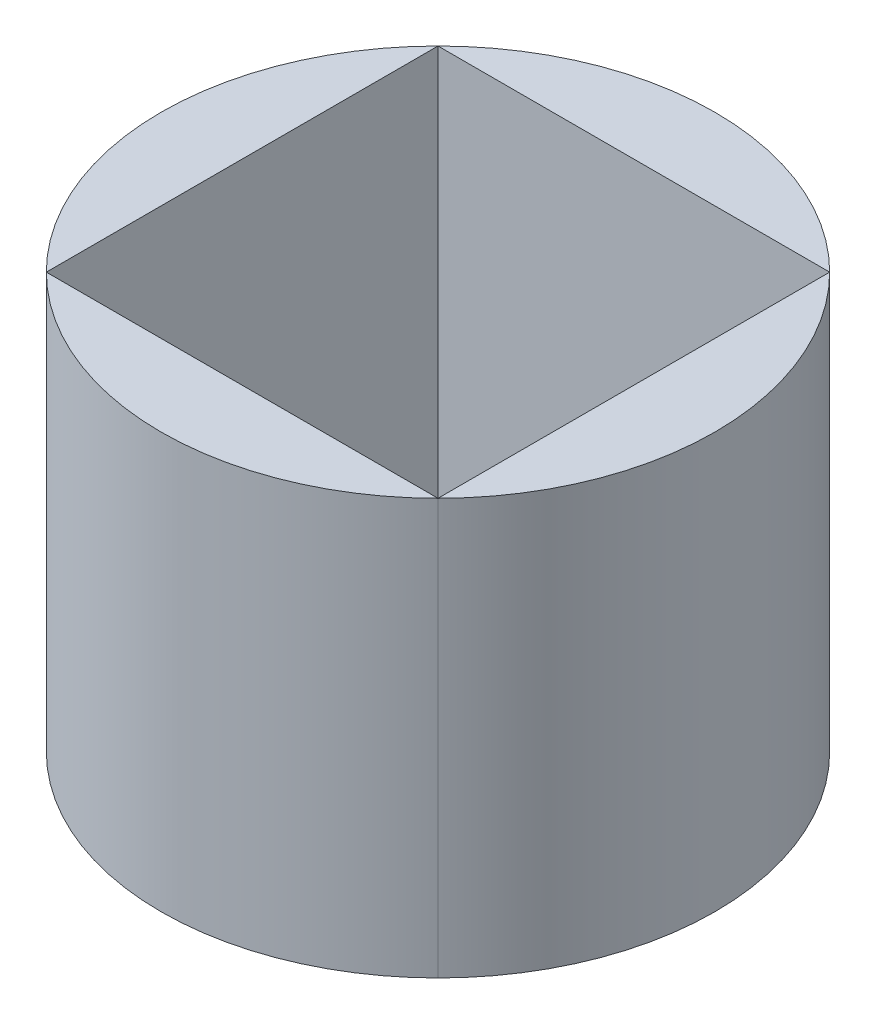
ISO-10303-21;
HEADER;
FILE_DESCRIPTION(('STEP AP214'),'2;1');
FILE_NAME('part.step','',(''),(''),'','','');
FILE_SCHEMA(('AUTOMOTIVE_DESIGN { 1 0 10303 214 1 1 1 1 }'));
ENDSEC;
DATA;
#1=APPLICATION_CONTEXT('core data for automotive mechanical design processes');
#2=APPLICATION_PROTOCOL_DEFINITION('international standard','automotive_design',2000,#1);
#3=PRODUCT_CONTEXT('',#1,'mechanical');
#4=PRODUCT('Part','Part','',(#3));
#5=PRODUCT_RELATED_PRODUCT_CATEGORY('part','',(#4));
#6=PRODUCT_DEFINITION_FORMATION('','',#4);
#7=PRODUCT_DEFINITION_CONTEXT('part definition',#1,'design');
#8=PRODUCT_DEFINITION('design','',#6,#7);
#9=PRODUCT_DEFINITION_SHAPE('','',#8);
#10=(LENGTH_UNIT() NAMED_UNIT(*) SI_UNIT(.MILLI.,.METRE.));
#11=(NAMED_UNIT(*) PLANE_ANGLE_UNIT() SI_UNIT($,.RADIAN.));
#12=(NAMED_UNIT(*) SI_UNIT($,.STERADIAN.) SOLID_ANGLE_UNIT());
#13=UNCERTAINTY_MEASURE_WITH_UNIT(LENGTH_MEASURE(1.E-05),#10,'distance_accuracy_value','');
#14=(GEOMETRIC_REPRESENTATION_CONTEXT(3) GLOBAL_UNCERTAINTY_ASSIGNED_CONTEXT((#13)) GLOBAL_UNIT_ASSIGNED_CONTEXT((#10,
#11,#12)) REPRESENTATION_CONTEXT('',''));
#15=CARTESIAN_POINT('',(0.,0.,0.));
#16=DIRECTION('',(0.,0.,1.));
#17=DIRECTION('',(1.,0.,0.));
#18=AXIS2_PLACEMENT_3D('',#15,#16,#17);
#19=CARTESIAN_POINT('',(-1.41421356237309,3.,0.));
#20=DIRECTION('',(-1.,0.,0.));
#21=DIRECTION('',(0.,0.,1.));
#22=AXIS2_PLACEMENT_3D('',#19,#20,#21);
#23=PLANE('',#22);
#24=DIRECTION('',(0.,0.,-1.));
#25=VECTOR('',#24,1.);
#26=CARTESIAN_POINT('',(-1.41421356237309,0.,0.));
#27=LINE('',#26,#25);
#28=CARTESIAN_POINT('',(-1.41421356237309,0.,1.41421356237309));
#29=VERTEX_POINT('',#28);
#30=CARTESIAN_POINT('',(-1.41421356237309,0.,-1.4142135623731));
#31=VERTEX_POINT('',#30);
#32=EDGE_CURVE('E85',#29,#31,#27,.T.);
#33=ORIENTED_EDGE('',*,*,#32,.T.);
#34=DIRECTION('',(0.,-1.,0.));
#35=VECTOR('',#34,1.);
#36=CARTESIAN_POINT('',(-1.41421356237309,3.,-1.4142135623731));
#37=LINE('',#36,#35);
#38=CARTESIAN_POINT('',(-1.41421356237309,3.,-1.4142135623731));
#39=VERTEX_POINT('',#38);
#40=EDGE_CURVE('E12',#39,#31,#37,.T.);
#41=ORIENTED_EDGE('',*,*,#40,.F.);
#42=DIRECTION('',(0.,0.,-1.));
#43=VECTOR('',#42,1.);
#44=CARTESIAN_POINT('',(-1.41421356237309,3.,0.));
#45=LINE('',#44,#43);
#46=CARTESIAN_POINT('',(-1.41421356237309,3.,1.41421356237309));
#47=VERTEX_POINT('',#46);
#48=EDGE_CURVE('E84',#47,#39,#45,.T.);
#49=ORIENTED_EDGE('',*,*,#48,.F.);
#50=DIRECTION('',(0.,-1.,0.));
#51=VECTOR('',#50,1.);
#52=CARTESIAN_POINT('',(-1.41421356237309,3.,1.41421356237309));
#53=LINE('',#52,#51);
#54=EDGE_CURVE('E62',#47,#29,#53,.T.);
#55=ORIENTED_EDGE('',*,*,#54,.T.);
#56=EDGE_LOOP('',(#33,#41,#49,#55));
#57=FACE_BOUND('',#56,.T.);
#58=ADVANCED_FACE('F54',(#57),#23,.F.);
#59=CARTESIAN_POINT('',(0.,3.,0.));
#60=DIRECTION('',(0.,-1.,0.));
#61=DIRECTION('',(0.,0.,-1.));
#62=AXIS2_PLACEMENT_3D('',#59,#60,#61);
#63=CYLINDRICAL_SURFACE('',#62,2.);
#64=CARTESIAN_POINT('',(0.,0.,0.));
#65=DIRECTION('',(0.,1.,0.));
#66=DIRECTION('',(0.,0.,1.));
#67=AXIS2_PLACEMENT_3D('',#64,#65,#66);
#68=CIRCLE('',#67,2.);
#69=EDGE_CURVE('E77',#31,#29,#68,.T.);
#70=ORIENTED_EDGE('',*,*,#69,.T.);
#71=ORIENTED_EDGE('',*,*,#54,.F.);
#72=CARTESIAN_POINT('',(0.,3.,0.));
#73=DIRECTION('',(0.,1.,0.));
#74=DIRECTION('',(0.,0.,1.));
#75=AXIS2_PLACEMENT_3D('',#72,#73,#74);
#76=CIRCLE('',#75,2.);
#77=EDGE_CURVE('E69',#39,#47,#76,.T.);
#78=ORIENTED_EDGE('',*,*,#77,.F.);
#79=ORIENTED_EDGE('',*,*,#40,.T.);
#80=EDGE_LOOP('',(#70,#71,#78,#79));
#81=FACE_BOUND('',#80,.T.);
#82=ADVANCED_FACE('F80',(#81),#63,.T.);
#83=CARTESIAN_POINT('',(0.,3.,0.));
#84=DIRECTION('',(0.,1.,0.));
#85=DIRECTION('',(0.,0.,1.));
#86=AXIS2_PLACEMENT_3D('',#83,#84,#85);
#87=PLANE('',#86);
#88=ORIENTED_EDGE('',*,*,#48,.T.);
#89=ORIENTED_EDGE('',*,*,#77,.T.);
#90=EDGE_LOOP('',(#88,#89));
#91=FACE_BOUND('',#90,.T.);
#92=ADVANCED_FACE('F92',(#91),#87,.T.);
#93=CARTESIAN_POINT('',(0.,0.,0.));
#94=DIRECTION('',(0.,1.,0.));
#95=DIRECTION('',(0.,0.,1.));
#96=AXIS2_PLACEMENT_3D('',#93,#94,#95);
#97=PLANE('',#96);
#98=ORIENTED_EDGE('',*,*,#32,.F.);
#99=ORIENTED_EDGE('',*,*,#69,.F.);
#100=EDGE_LOOP('',(#98,#99));
#101=FACE_BOUND('',#100,.T.);
#102=ADVANCED_FACE('F88',(#101),#97,.F.);
#103=CLOSED_SHELL('',(#58,#82,#92,#102));
#104=MANIFOLD_SOLID_BREP('B2',#103);
#105=CARTESIAN_POINT('',(0.,3.,1.41421356237309));
#106=DIRECTION('',(0.,0.,-1.));
#107=DIRECTION('',(-1.,0.,0.));
#108=AXIS2_PLACEMENT_3D('',#105,#106,#107);
#109=PLANE('',#108);
#110=DIRECTION('',(1.,0.,0.));
#111=VECTOR('',#110,1.);
#112=CARTESIAN_POINT('',(0.,0.,1.41421356237309));
#113=LINE('',#112,#111);
#114=CARTESIAN_POINT('',(-1.41421356237309,0.,1.41421356237309));
#115=VERTEX_POINT('',#114);
#116=CARTESIAN_POINT('',(1.41421356237309,0.,1.41421356237309));
#117=VERTEX_POINT('',#116);
#118=EDGE_CURVE('E164',#115,#117,#113,.T.);
#119=ORIENTED_EDGE('',*,*,#118,.F.);
#120=DIRECTION('',(0.,-1.,0.));
#121=VECTOR('',#120,1.);
#122=CARTESIAN_POINT('',(-1.41421356237309,3.,1.41421356237309));
#123=LINE('',#122,#121);
#124=CARTESIAN_POINT('',(-1.41421356237309,3.,1.41421356237309));
#125=VERTEX_POINT('',#124);
#126=EDGE_CURVE('E52',#125,#115,#123,.T.);
#127=ORIENTED_EDGE('',*,*,#126,.F.);
#128=DIRECTION('',(1.,0.,0.));
#129=VECTOR('',#128,1.);
#130=CARTESIAN_POINT('',(0.,3.,1.41421356237309));
#131=LINE('',#130,#129);
#132=CARTESIAN_POINT('',(1.41421356237309,3.,1.41421356237309));
#133=VERTEX_POINT('',#132);
#134=EDGE_CURVE('E165',#125,#133,#131,.T.);
#135=ORIENTED_EDGE('',*,*,#134,.T.);
#136=DIRECTION('',(0.,-1.,0.));
#137=VECTOR('',#136,1.);
#138=CARTESIAN_POINT('',(1.41421356237309,3.,1.41421356237309));
#139=LINE('',#138,#137);
#140=EDGE_CURVE('E144',#133,#117,#139,.T.);
#141=ORIENTED_EDGE('',*,*,#140,.T.);
#142=EDGE_LOOP('',(#119,#127,#135,#141));
#143=FACE_BOUND('',#142,.T.);
#144=ADVANCED_FACE('F136',(#143),#109,.T.);
#145=CARTESIAN_POINT('',(0.,3.,0.));
#146=DIRECTION('',(0.,-1.,0.));
#147=DIRECTION('',(0.,0.,-1.));
#148=AXIS2_PLACEMENT_3D('',#145,#146,#147);
#149=CYLINDRICAL_SURFACE('',#148,2.);
#150=CARTESIAN_POINT('',(0.,0.,0.));
#151=DIRECTION('',(0.,1.,0.));
#152=DIRECTION('',(0.,0.,1.));
#153=AXIS2_PLACEMENT_3D('',#150,#151,#152);
#154=CIRCLE('',#153,2.);
#155=EDGE_CURVE('E166',#115,#117,#154,.T.);
#156=ORIENTED_EDGE('',*,*,#155,.T.);
#157=ORIENTED_EDGE('',*,*,#140,.F.);
#158=CARTESIAN_POINT('',(0.,3.,0.));
#159=DIRECTION('',(0.,1.,0.));
#160=DIRECTION('',(0.,0.,1.));
#161=AXIS2_PLACEMENT_3D('',#158,#159,#160);
#162=CIRCLE('',#161,2.);
#163=EDGE_CURVE('E151',#125,#133,#162,.T.);
#164=ORIENTED_EDGE('',*,*,#163,.F.);
#165=ORIENTED_EDGE('',*,*,#126,.T.);
#166=EDGE_LOOP('',(#156,#157,#164,#165));
#167=FACE_BOUND('',#166,.T.);
#168=ADVANCED_FACE('F167',(#167),#149,.T.);
#169=CARTESIAN_POINT('',(0.,3.,0.));
#170=DIRECTION('',(0.,1.,0.));
#171=DIRECTION('',(0.,0.,1.));
#172=AXIS2_PLACEMENT_3D('',#169,#170,#171);
#173=PLANE('',#172);
#174=ORIENTED_EDGE('',*,*,#134,.F.);
#175=ORIENTED_EDGE('',*,*,#163,.T.);
#176=EDGE_LOOP('',(#174,#175));
#177=FACE_BOUND('',#176,.T.);
#178=ADVANCED_FACE('F175',(#177),#173,.T.);
#179=CARTESIAN_POINT('',(0.,0.,0.));
#180=DIRECTION('',(0.,1.,0.));
#181=DIRECTION('',(0.,0.,1.));
#182=AXIS2_PLACEMENT_3D('',#179,#180,#181);
#183=PLANE('',#182);
#184=ORIENTED_EDGE('',*,*,#118,.T.);
#185=ORIENTED_EDGE('',*,*,#155,.F.);
#186=EDGE_LOOP('',(#184,#185));
#187=FACE_BOUND('',#186,.T.);
#188=ADVANCED_FACE('F170',(#187),#183,.F.);
#189=CLOSED_SHELL('',(#144,#168,#178,#188));
#190=MANIFOLD_SOLID_BREP('B6',#189);
#191=CARTESIAN_POINT('',(1.41421356237309,3.,0.));
#192=DIRECTION('',(-1.,0.,0.));
#193=DIRECTION('',(0.,0.,1.));
#194=AXIS2_PLACEMENT_3D('',#191,#192,#193);
#195=PLANE('',#194);
#196=DIRECTION('',(0.,0.,-1.));
#197=VECTOR('',#196,1.);
#198=CARTESIAN_POINT('',(1.41421356237309,0.,0.));
#199=LINE('',#198,#197);
#200=CARTESIAN_POINT('',(1.41421356237309,0.,1.41421356237309));
#201=VERTEX_POINT('',#200);
#202=CARTESIAN_POINT('',(1.41421356237309,0.,-1.4142135623731));
#203=VERTEX_POINT('',#202);
#204=EDGE_CURVE('E245',#201,#203,#199,.T.);
#205=ORIENTED_EDGE('',*,*,#204,.F.);
#206=DIRECTION('',(0.,-1.,0.));
#207=VECTOR('',#206,1.);
#208=CARTESIAN_POINT('',(1.41421356237309,3.,1.41421356237309));
#209=LINE('',#208,#207);
#210=CARTESIAN_POINT('',(1.41421356237309,3.,1.41421356237309));
#211=VERTEX_POINT('',#210);
#212=EDGE_CURVE('E134',#211,#201,#209,.T.);
#213=ORIENTED_EDGE('',*,*,#212,.F.);
#214=DIRECTION('',(0.,0.,-1.));
#215=VECTOR('',#214,1.);
#216=CARTESIAN_POINT('',(1.41421356237309,3.,0.));
#217=LINE('',#216,#215);
#218=CARTESIAN_POINT('',(1.41421356237309,3.,-1.4142135623731));
#219=VERTEX_POINT('',#218);
#220=EDGE_CURVE('E246',#211,#219,#217,.T.);
#221=ORIENTED_EDGE('',*,*,#220,.T.);
#222=DIRECTION('',(0.,-1.,0.));
#223=VECTOR('',#222,1.);
#224=CARTESIAN_POINT('',(1.41421356237309,3.,-1.4142135623731));
#225=LINE('',#224,#223);
#226=EDGE_CURVE('E225',#219,#203,#225,.T.);
#227=ORIENTED_EDGE('',*,*,#226,.T.);
#228=EDGE_LOOP('',(#205,#213,#221,#227));
#229=FACE_BOUND('',#228,.T.);
#230=ADVANCED_FACE('F217',(#229),#195,.T.);
#231=CARTESIAN_POINT('',(0.,3.,0.));
#232=DIRECTION('',(0.,-1.,0.));
#233=DIRECTION('',(0.,0.,-1.));
#234=AXIS2_PLACEMENT_3D('',#231,#232,#233);
#235=CYLINDRICAL_SURFACE('',#234,2.);
#236=CARTESIAN_POINT('',(0.,0.,0.));
#237=DIRECTION('',(0.,1.,0.));
#238=DIRECTION('',(0.,0.,1.));
#239=AXIS2_PLACEMENT_3D('',#236,#237,#238);
#240=CIRCLE('',#239,2.);
#241=EDGE_CURVE('E247',#201,#203,#240,.T.);
#242=ORIENTED_EDGE('',*,*,#241,.T.);
#243=ORIENTED_EDGE('',*,*,#226,.F.);
#244=CARTESIAN_POINT('',(0.,3.,0.));
#245=DIRECTION('',(0.,1.,0.));
#246=DIRECTION('',(0.,0.,1.));
#247=AXIS2_PLACEMENT_3D('',#244,#245,#246);
#248=CIRCLE('',#247,2.);
#249=EDGE_CURVE('E232',#211,#219,#248,.T.);
#250=ORIENTED_EDGE('',*,*,#249,.F.);
#251=ORIENTED_EDGE('',*,*,#212,.T.);
#252=EDGE_LOOP('',(#242,#243,#250,#251));
#253=FACE_BOUND('',#252,.T.);
#254=ADVANCED_FACE('F248',(#253),#235,.T.);
#255=CARTESIAN_POINT('',(0.,3.,0.));
#256=DIRECTION('',(0.,1.,0.));
#257=DIRECTION('',(0.,0.,1.));
#258=AXIS2_PLACEMENT_3D('',#255,#256,#257);
#259=PLANE('',#258);
#260=ORIENTED_EDGE('',*,*,#220,.F.);
#261=ORIENTED_EDGE('',*,*,#249,.T.);
#262=EDGE_LOOP('',(#260,#261));
#263=FACE_BOUND('',#262,.T.);
#264=ADVANCED_FACE('F256',(#263),#259,.T.);
#265=CARTESIAN_POINT('',(0.,0.,0.));
#266=DIRECTION('',(0.,1.,0.));
#267=DIRECTION('',(0.,0.,1.));
#268=AXIS2_PLACEMENT_3D('',#265,#266,#267);
#269=PLANE('',#268);
#270=ORIENTED_EDGE('',*,*,#204,.T.);
#271=ORIENTED_EDGE('',*,*,#241,.F.);
#272=EDGE_LOOP('',(#270,#271));
#273=FACE_BOUND('',#272,.T.);
#274=ADVANCED_FACE('F251',(#273),#269,.F.);
#275=CLOSED_SHELL('',(#230,#254,#264,#274));
#276=MANIFOLD_SOLID_BREP('B46',#275);
#277=CARTESIAN_POINT('',(0.,3.,-1.4142135623731));
#278=DIRECTION('',(0.,0.,-1.));
#279=DIRECTION('',(-1.,0.,0.));
#280=AXIS2_PLACEMENT_3D('',#277,#278,#279);
#281=PLANE('',#280);
#282=DIRECTION('',(1.,0.,0.));
#283=VECTOR('',#282,1.);
#284=CARTESIAN_POINT('',(0.,0.,-1.4142135623731));
#285=LINE('',#284,#283);
#286=CARTESIAN_POINT('',(-1.41421356237309,0.,-1.4142135623731));
#287=VERTEX_POINT('',#286);
#288=CARTESIAN_POINT('',(1.41421356237309,0.,-1.4142135623731));
#289=VERTEX_POINT('',#288);
#290=EDGE_CURVE('E320',#287,#289,#285,.T.);
#291=ORIENTED_EDGE('',*,*,#290,.T.);
#292=DIRECTION('',(0.,-1.,0.));
#293=VECTOR('',#292,1.);
#294=CARTESIAN_POINT('',(1.41421356237309,3.,-1.4142135623731));
#295=LINE('',#294,#293);
#296=CARTESIAN_POINT('',(1.41421356237309,3.,-1.4142135623731));
#297=VERTEX_POINT('',#296);
#298=EDGE_CURVE('E215',#297,#289,#295,.T.);
#299=ORIENTED_EDGE('',*,*,#298,.F.);
#300=DIRECTION('',(1.,0.,0.));
#301=VECTOR('',#300,1.);
#302=CARTESIAN_POINT('',(0.,3.,-1.4142135623731));
#303=LINE('',#302,#301);
#304=CARTESIAN_POINT('',(-1.41421356237309,3.,-1.4142135623731));
#305=VERTEX_POINT('',#304);
#306=EDGE_CURVE('E319',#305,#297,#303,.T.);
#307=ORIENTED_EDGE('',*,*,#306,.F.);
#308=DIRECTION('',(0.,-1.,0.));
#309=VECTOR('',#308,1.);
#310=CARTESIAN_POINT('',(-1.41421356237309,3.,-1.4142135623731));
#311=LINE('',#310,#309);
#312=EDGE_CURVE('E297',#305,#287,#311,.T.);
#313=ORIENTED_EDGE('',*,*,#312,.T.);
#314=EDGE_LOOP('',(#291,#299,#307,#313));
#315=FACE_BOUND('',#314,.T.);
#316=ADVANCED_FACE('F289',(#315),#281,.F.);
#317=CARTESIAN_POINT('',(0.,3.,0.));
#318=DIRECTION('',(0.,-1.,0.));
#319=DIRECTION('',(0.,0.,-1.));
#320=AXIS2_PLACEMENT_3D('',#317,#318,#319);
#321=CYLINDRICAL_SURFACE('',#320,2.);
#322=CARTESIAN_POINT('',(0.,0.,0.));
#323=DIRECTION('',(0.,1.,0.));
#324=DIRECTION('',(0.,0.,1.));
#325=AXIS2_PLACEMENT_3D('',#322,#323,#324);
#326=CIRCLE('',#325,2.);
#327=EDGE_CURVE('E312',#289,#287,#326,.T.);
#328=ORIENTED_EDGE('',*,*,#327,.T.);
#329=ORIENTED_EDGE('',*,*,#312,.F.);
#330=CARTESIAN_POINT('',(0.,3.,0.));
#331=DIRECTION('',(0.,1.,0.));
#332=DIRECTION('',(0.,0.,1.));
#333=AXIS2_PLACEMENT_3D('',#330,#331,#332);
#334=CIRCLE('',#333,2.);
#335=EDGE_CURVE('E304',#297,#305,#334,.T.);
#336=ORIENTED_EDGE('',*,*,#335,.F.);
#337=ORIENTED_EDGE('',*,*,#298,.T.);
#338=EDGE_LOOP('',(#328,#329,#336,#337));
#339=FACE_BOUND('',#338,.T.);
#340=ADVANCED_FACE('F315',(#339),#321,.T.);
#341=CARTESIAN_POINT('',(0.,3.,0.));
#342=DIRECTION('',(0.,1.,0.));
#343=DIRECTION('',(0.,0.,1.));
#344=AXIS2_PLACEMENT_3D('',#341,#342,#343);
#345=PLANE('',#344);
#346=ORIENTED_EDGE('',*,*,#306,.T.);
#347=ORIENTED_EDGE('',*,*,#335,.T.);
#348=EDGE_LOOP('',(#346,#347));
#349=FACE_BOUND('',#348,.T.);
#350=ADVANCED_FACE('F327',(#349),#345,.T.);
#351=CARTESIAN_POINT('',(0.,0.,0.));
#352=DIRECTION('',(0.,1.,0.));
#353=DIRECTION('',(0.,0.,1.));
#354=AXIS2_PLACEMENT_3D('',#351,#352,#353);
#355=PLANE('',#354);
#356=ORIENTED_EDGE('',*,*,#290,.F.);
#357=ORIENTED_EDGE('',*,*,#327,.F.);
#358=EDGE_LOOP('',(#356,#357));
#359=FACE_BOUND('',#358,.T.);
#360=ADVANCED_FACE('F323',(#359),#355,.F.);
#361=CLOSED_SHELL('',(#316,#340,#350,#360));
#362=MANIFOLD_SOLID_BREP('B128',#361);
#363=ADVANCED_BREP_SHAPE_REPRESENTATION('',(#18,#104,#190,#276,#362),#14);
#364=SHAPE_DEFINITION_REPRESENTATION(#9,#363);
ENDSEC;
END-ISO-10303-21;
